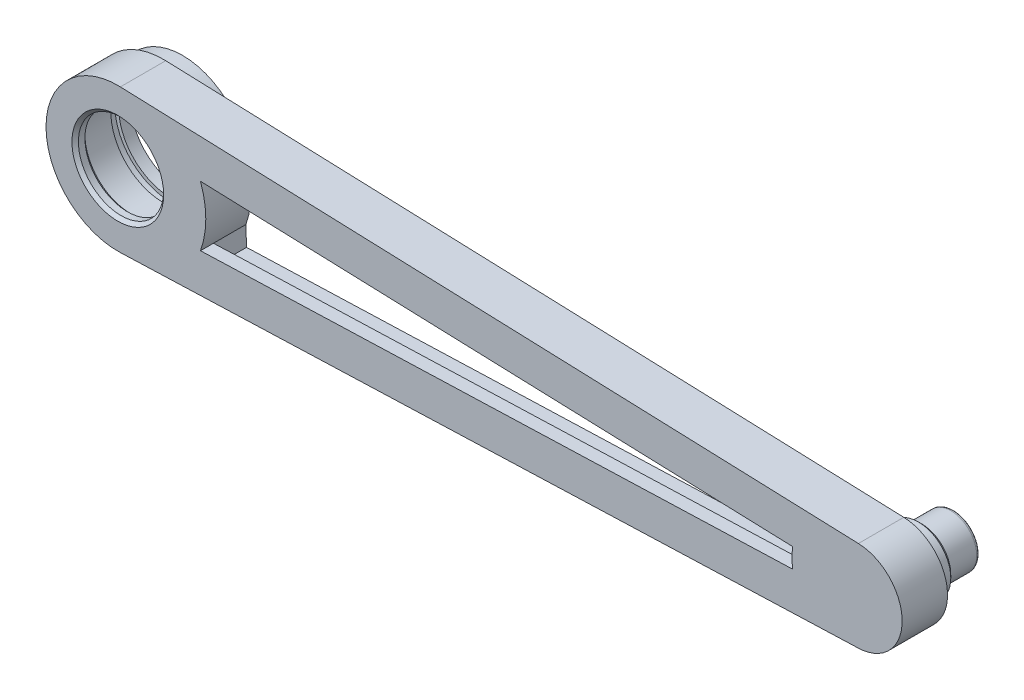
ISO-10303-21;
HEADER;
FILE_DESCRIPTION(('STEP AP214'),'2;1');
FILE_NAME('part.step','',(''),(''),'','','');
FILE_SCHEMA(('AUTOMOTIVE_DESIGN { 1 0 10303 214 1 1 1 1 }'));
ENDSEC;
DATA;
#1=APPLICATION_CONTEXT('core data for automotive mechanical design processes');
#2=APPLICATION_PROTOCOL_DEFINITION('international standard','automotive_design',2000,#1);
#3=PRODUCT_CONTEXT('',#1,'mechanical');
#4=PRODUCT('Part','Part','',(#3));
#5=PRODUCT_RELATED_PRODUCT_CATEGORY('part','',(#4));
#6=PRODUCT_DEFINITION_FORMATION('','',#4);
#7=PRODUCT_DEFINITION_CONTEXT('part definition',#1,'design');
#8=PRODUCT_DEFINITION('design','',#6,#7);
#9=PRODUCT_DEFINITION_SHAPE('','',#8);
#10=(LENGTH_UNIT() NAMED_UNIT(*) SI_UNIT(.MILLI.,.METRE.));
#11=(NAMED_UNIT(*) PLANE_ANGLE_UNIT() SI_UNIT($,.RADIAN.));
#12=(NAMED_UNIT(*) SI_UNIT($,.STERADIAN.) SOLID_ANGLE_UNIT());
#13=UNCERTAINTY_MEASURE_WITH_UNIT(LENGTH_MEASURE(1.E-05),#10,'distance_accuracy_value','');
#14=(GEOMETRIC_REPRESENTATION_CONTEXT(3) GLOBAL_UNCERTAINTY_ASSIGNED_CONTEXT((#13)) GLOBAL_UNIT_ASSIGNED_CONTEXT((#10,
#11,#12)) REPRESENTATION_CONTEXT('',''));
#15=CARTESIAN_POINT('',(0.,0.,0.));
#16=DIRECTION('',(0.,0.,1.));
#17=DIRECTION('',(1.,0.,0.));
#18=AXIS2_PLACEMENT_3D('',#15,#16,#17);
#19=CARTESIAN_POINT('',(0.,0.,7.));
#20=DIRECTION('',(0.,0.,-1.));
#21=DIRECTION('',(-1.,0.,0.));
#22=AXIS2_PLACEMENT_3D('',#19,#20,#21);
#23=CYLINDRICAL_SURFACE('',#22,8.075);
#24=CARTESIAN_POINT('',(0.,0.,-3.));
#25=DIRECTION('',(0.,0.,-1.));
#26=DIRECTION('',(-1.,0.,0.));
#27=AXIS2_PLACEMENT_3D('',#24,#25,#26);
#28=CIRCLE('',#27,8.075);
#29=CARTESIAN_POINT('',(-8.075,0.,-3.));
#30=VERTEX_POINT('',#29);
#31=EDGE_CURVE('E315',#30,#30,#28,.T.);
#32=ORIENTED_EDGE('',*,*,#31,.T.);
#33=EDGE_LOOP('',(#32));
#34=FACE_BOUND('',#33,.T.);
#35=CARTESIAN_POINT('',(0.,0.,-1.2));
#36=DIRECTION('',(0.,0.,1.));
#37=DIRECTION('',(1.,0.,0.));
#38=AXIS2_PLACEMENT_3D('',#35,#36,#37);
#39=CIRCLE('',#38,8.075);
#40=CARTESIAN_POINT('',(8.075,0.,-1.2));
#41=VERTEX_POINT('',#40);
#42=EDGE_CURVE('E51',#41,#41,#39,.T.);
#43=ORIENTED_EDGE('',*,*,#42,.T.);
#44=EDGE_LOOP('',(#43));
#45=FACE_BOUND('',#44,.T.);
#46=ADVANCED_FACE('F50',(#34,#45),#23,.F.);
#47=CARTESIAN_POINT('',(0.,0.,0.));
#48=DIRECTION('',(0.,0.,1.));
#49=DIRECTION('',(1.,0.,0.));
#50=AXIS2_PLACEMENT_3D('',#47,#48,#49);
#51=PLANE('',#50);
#52=DIRECTION('',(0.0342782664469188,-0.99941232754524,0.));
#53=VECTOR('',#52,1.);
#54=CARTESIAN_POINT('',(104.114209315076,-1.50703103281399,0.));
#55=LINE('',#54,#53);
#56=CARTESIAN_POINT('',(104.114209315076,-1.50703103281399,0.));
#57=VERTEX_POINT('',#56);
#58=CARTESIAN_POINT('',(104.217044114417,-4.50526801544971,0.));
#59=VERTEX_POINT('',#58);
#60=EDGE_CURVE('E61',#57,#59,#55,.T.);
#61=ORIENTED_EDGE('',*,*,#60,.F.);
#62=CARTESIAN_POINT('',(114.,0.,0.));
#63=DIRECTION('',(0.,0.,-1.));
#64=DIRECTION('',(-1.,0.,0.));
#65=AXIS2_PLACEMENT_3D('',#62,#63,#64);
#66=CIRCLE('',#65,9.99999999999997);
#67=CARTESIAN_POINT('',(104.114755838496,1.51061175271504,0.));
#68=VERTEX_POINT('',#67);
#69=EDGE_CURVE('E217',#57,#68,#66,.T.);
#70=ORIENTED_EDGE('',*,*,#69,.T.);
#71=DIRECTION('',(-0.0342436974789945,-0.999413512607753,0.));
#72=VECTOR('',#71,1.);
#73=CARTESIAN_POINT('',(104.217486930932,4.5088522905383,0.));
#74=LINE('',#73,#72);
#75=CARTESIAN_POINT('',(104.217486930932,4.5088522905383,0.));
#76=VERTEX_POINT('',#75);
#77=EDGE_CURVE('E200',#76,#68,#74,.T.);
#78=ORIENTED_EDGE('',*,*,#77,.F.);
#79=DIRECTION('',(0.999413512607753,-0.0342436974789916,0.));
#80=VECTOR('',#79,1.);
#81=CARTESIAN_POINT('',(12.8598047369581,7.63911298039967,0.));
#82=LINE('',#81,#80);
#83=CARTESIAN_POINT('',(12.8598047369581,7.63911298039967,0.));
#84=VERTEX_POINT('',#83);
#85=EDGE_CURVE('E202',#84,#76,#82,.T.);
#86=ORIENTED_EDGE('',*,*,#85,.F.);
#87=DIRECTION('',(0.0342436974789916,0.999413512607753,0.));
#88=VECTOR('',#87,1.);
#89=CARTESIAN_POINT('',(12.8598047369581,7.63911298039967,0.));
#90=LINE('',#89,#88);
#91=CARTESIAN_POINT('',(12.7570736445211,4.64087244257641,0.));
#92=VERTEX_POINT('',#91);
#93=EDGE_CURVE('E72',#92,#84,#90,.T.);
#94=ORIENTED_EDGE('',*,*,#93,.F.);
#95=CARTESIAN_POINT('',(0.,0.,0.));
#96=DIRECTION('',(0.,0.,-1.));
#97=DIRECTION('',(-1.,0.,0.));
#98=AXIS2_PLACEMENT_3D('',#95,#96,#97);
#99=CIRCLE('',#98,13.575);
#100=CARTESIAN_POINT('',(12.7572341613009,-4.64043118187699,0.));
#101=VERTEX_POINT('',#100);
#102=EDGE_CURVE('E222',#92,#101,#99,.T.);
#103=ORIENTED_EDGE('',*,*,#102,.T.);
#104=DIRECTION('',(-0.0342782664469217,0.99941232754524,0.));
#105=VECTOR('',#104,1.);
#106=CARTESIAN_POINT('',(12.7572341613009,-4.64043118187699,0.));
#107=LINE('',#106,#105);
#108=CARTESIAN_POINT('',(12.8600689606417,-7.63866816451271,0.));
#109=VERTEX_POINT('',#108);
#110=EDGE_CURVE('E167',#109,#101,#107,.T.);
#111=ORIENTED_EDGE('',*,*,#110,.F.);
#112=DIRECTION('',(-0.99941232754524,-0.034278266446919,0.));
#113=VECTOR('',#112,1.);
#114=CARTESIAN_POINT('',(104.217044114417,-4.50526801544971,0.));
#115=LINE('',#114,#113);
#116=EDGE_CURVE('E175',#59,#109,#115,.T.);
#117=ORIENTED_EDGE('',*,*,#116,.F.);
#118=EDGE_LOOP('',(#61,#70,#78,#86,#94,#103,#111,#117));
#119=FACE_BOUND('',#118,.T.);
#120=DIRECTION('',(0.999359513847041,0.0357849421321992,0.));
#121=VECTOR('',#120,1.);
#122=CARTESIAN_POINT('',(0.396318234114106,-11.067906615856,0.));
#123=LINE('',#122,#121);
#124=CARTESIAN_POINT('',(0.396318234114106,-11.067906615856,0.));
#125=VERTEX_POINT('',#124);
#126=CARTESIAN_POINT('',(114.,-7.00000000000001,0.));
#127=VERTEX_POINT('',#126);
#128=EDGE_CURVE('E249',#125,#127,#123,.T.);
#129=ORIENTED_EDGE('',*,*,#128,.F.);
#130=CARTESIAN_POINT('',(0.,0.,0.));
#131=DIRECTION('',(0.,0.,1.));
#132=DIRECTION('',(1.,0.,0.));
#133=AXIS2_PLACEMENT_3D('',#130,#131,#132);
#134=CIRCLE('',#133,11.075);
#135=CARTESIAN_POINT('',(0.395882675438596,11.067922203706,0.));
#136=VERTEX_POINT('',#135);
#137=EDGE_CURVE('E253',#136,#125,#134,.T.);
#138=ORIENTED_EDGE('',*,*,#137,.F.);
#139=DIRECTION('',(0.999360921327853,-0.0357456140350877,0.));
#140=VECTOR('',#139,1.);
#141=CARTESIAN_POINT('',(0.395882675438596,11.067922203706,0.));
#142=LINE('',#141,#140);
#143=CARTESIAN_POINT('',(114.250219298246,6.99552644929498,0.));
#144=VERTEX_POINT('',#143);
#145=EDGE_CURVE('E269',#136,#144,#142,.T.);
#146=ORIENTED_EDGE('',*,*,#145,.T.);
#147=CARTESIAN_POINT('',(114.,0.,0.));
#148=DIRECTION('',(0.,0.,1.));
#149=DIRECTION('',(1.,0.,0.));
#150=AXIS2_PLACEMENT_3D('',#147,#148,#149);
#151=CIRCLE('',#150,7.00000000000002);
#152=EDGE_CURVE('E265',#127,#144,#151,.T.);
#153=ORIENTED_EDGE('',*,*,#152,.F.);
#154=EDGE_LOOP('',(#129,#138,#146,#153));
#155=FACE_BOUND('',#154,.T.);
#156=CARTESIAN_POINT('',(114.,0.,0.));
#157=DIRECTION('',(0.,0.,1.));
#158=DIRECTION('',(1.,0.,0.));
#159=AXIS2_PLACEMENT_3D('',#156,#157,#158);
#160=CIRCLE('',#159,5.);
#161=CARTESIAN_POINT('',(119.,0.,0.));
#162=VERTEX_POINT('',#161);
#163=EDGE_CURVE('E281',#162,#162,#160,.F.);
#164=ORIENTED_EDGE('',*,*,#163,.F.);
#165=EDGE_LOOP('',(#164));
#166=FACE_BOUND('',#165,.T.);
#167=CARTESIAN_POINT('',(0.,0.,0.));
#168=DIRECTION('',(0.,0.,1.));
#169=DIRECTION('',(1.,0.,0.));
#170=AXIS2_PLACEMENT_3D('',#167,#168,#169);
#171=CIRCLE('',#170,10.075);
#172=CARTESIAN_POINT('',(10.075,0.,0.));
#173=VERTEX_POINT('',#172);
#174=EDGE_CURVE('E11',#173,#173,#171,.F.);
#175=ORIENTED_EDGE('',*,*,#174,.F.);
#176=EDGE_LOOP('',(#175));
#177=FACE_BOUND('',#176,.T.);
#178=ADVANCED_FACE('F350',(#119,#155,#166,#177),#51,.F.);
#179=CARTESIAN_POINT('',(114.,0.,-10.));
#180=DIRECTION('',(0.,0.,1.));
#181=DIRECTION('',(1.,0.,0.));
#182=AXIS2_PLACEMENT_3D('',#179,#180,#181);
#183=CYLINDRICAL_SURFACE('',#182,4.00000000000001);
#184=CARTESIAN_POINT('',(114.,0.,-7.5));
#185=DIRECTION('',(0.,0.,-1.));
#186=DIRECTION('',(-1.,0.,0.));
#187=AXIS2_PLACEMENT_3D('',#184,#185,#186);
#188=CIRCLE('',#187,4.00000000000001);
#189=CARTESIAN_POINT('',(110.,0.,-7.5));
#190=VERTEX_POINT('',#189);
#191=EDGE_CURVE('E57',#190,#190,#188,.F.);
#192=ORIENTED_EDGE('',*,*,#191,.T.);
#193=EDGE_LOOP('',(#192));
#194=FACE_BOUND('',#193,.T.);
#195=CARTESIAN_POINT('',(114.,0.,-3.));
#196=DIRECTION('',(0.,0.,-1.));
#197=DIRECTION('',(-1.,0.,0.));
#198=AXIS2_PLACEMENT_3D('',#195,#196,#197);
#199=CIRCLE('',#198,4.00000000000001);
#200=CARTESIAN_POINT('',(110.,0.,-3.));
#201=VERTEX_POINT('',#200);
#202=EDGE_CURVE('E225',#201,#201,#199,.T.);
#203=ORIENTED_EDGE('',*,*,#202,.T.);
#204=EDGE_LOOP('',(#203));
#205=FACE_BOUND('',#204,.T.);
#206=ADVANCED_FACE('F360',(#194,#205),#183,.T.);
#207=CARTESIAN_POINT('',(0.173786764705882,5.07202357648435,98.8279298080084));
#208=DIRECTION('',(0.0342436974789916,0.999413512607753,0.));
#209=DIRECTION('',(-0.999413512607753,0.0342436974789916,0.));
#210=AXIS2_PLACEMENT_3D('',#207,#208,#209);
#211=PLANE('',#210);
#212=DIRECTION('',(-0.999413512607753,0.0342436974789916,0.));
#213=VECTOR('',#212,1.);
#214=CARTESIAN_POINT('',(12.7570736445211,4.64087244257641,5.));
#215=LINE('',#214,#213);
#216=CARTESIAN_POINT('',(104.114755838496,1.51061175271504,5.));
#217=VERTEX_POINT('',#216);
#218=CARTESIAN_POINT('',(12.7570736445211,4.64087244257641,5.));
#219=VERTEX_POINT('',#218);
#220=EDGE_CURVE('E192',#217,#219,#215,.T.);
#221=ORIENTED_EDGE('',*,*,#220,.F.);
#222=DIRECTION('',(0.,0.,-1.));
#223=VECTOR('',#222,1.);
#224=CARTESIAN_POINT('',(104.114755838496,1.51061175271504,98.8279298080084));
#225=LINE('',#224,#223);
#226=CARTESIAN_POINT('',(104.114755838496,1.51061175271504,7.00000000000001));
#227=VERTEX_POINT('',#226);
#228=EDGE_CURVE('E229',#227,#217,#225,.T.);
#229=ORIENTED_EDGE('',*,*,#228,.F.);
#230=DIRECTION('',(0.999413512607753,-0.0342436974789916,0.));
#231=VECTOR('',#230,1.);
#232=CARTESIAN_POINT('',(0.173786764705882,5.07202357648435,7.00000000000001));
#233=LINE('',#232,#231);
#234=CARTESIAN_POINT('',(12.7570736445211,4.64087244257641,7.00000000000001));
#235=VERTEX_POINT('',#234);
#236=EDGE_CURVE('E227',#235,#227,#233,.T.);
#237=ORIENTED_EDGE('',*,*,#236,.F.);
#238=DIRECTION('',(0.,0.,-1.));
#239=VECTOR('',#238,1.);
#240=CARTESIAN_POINT('',(12.7570736445211,4.64087244257641,98.8279298080084));
#241=LINE('',#240,#239);
#242=EDGE_CURVE('E228',#235,#219,#241,.T.);
#243=ORIENTED_EDGE('',*,*,#242,.T.);
#244=EDGE_LOOP('',(#221,#229,#237,#243));
#245=FACE_BOUND('',#244,.T.);
#246=ADVANCED_FACE('F374',(#245),#211,.F.);
#247=CARTESIAN_POINT('',(0.173962202218114,-5.07201756229209,98.8279298080084));
#248=DIRECTION('',(0.034278266446919,-0.99941232754524,0.));
#249=DIRECTION('',(0.99941232754524,0.034278266446919,0.));
#250=AXIS2_PLACEMENT_3D('',#247,#248,#249);
#251=PLANE('',#250);
#252=DIRECTION('',(0.99941232754524,0.034278266446919,0.));
#253=VECTOR('',#252,1.);
#254=CARTESIAN_POINT('',(104.114209315076,-1.50703103281399,5.));
#255=LINE('',#254,#253);
#256=CARTESIAN_POINT('',(12.7572341613009,-4.64043118187699,5.));
#257=VERTEX_POINT('',#256);
#258=CARTESIAN_POINT('',(104.114209315076,-1.50703103281399,5.));
#259=VERTEX_POINT('',#258);
#260=EDGE_CURVE('E157',#257,#259,#255,.T.);
#261=ORIENTED_EDGE('',*,*,#260,.F.);
#262=DIRECTION('',(0.,0.,-1.));
#263=VECTOR('',#262,1.);
#264=CARTESIAN_POINT('',(12.7572341613009,-4.64043118187699,98.8279298080084));
#265=LINE('',#264,#263);
#266=CARTESIAN_POINT('',(12.7572341613009,-4.64043118187699,7.00000000000001));
#267=VERTEX_POINT('',#266);
#268=EDGE_CURVE('E232',#267,#257,#265,.T.);
#269=ORIENTED_EDGE('',*,*,#268,.F.);
#270=DIRECTION('',(-0.99941232754524,-0.034278266446919,0.));
#271=VECTOR('',#270,1.);
#272=CARTESIAN_POINT('',(0.173962202218114,-5.07201756229209,7.00000000000001));
#273=LINE('',#272,#271);
#274=CARTESIAN_POINT('',(104.114209315076,-1.50703103281399,7.00000000000001));
#275=VERTEX_POINT('',#274);
#276=EDGE_CURVE('E220',#275,#267,#273,.T.);
#277=ORIENTED_EDGE('',*,*,#276,.F.);
#278=DIRECTION('',(0.,0.,-1.));
#279=VECTOR('',#278,1.);
#280=CARTESIAN_POINT('',(104.114209315076,-1.50703103281399,98.8279298080084));
#281=LINE('',#280,#279);
#282=EDGE_CURVE('E221',#275,#259,#281,.T.);
#283=ORIENTED_EDGE('',*,*,#282,.T.);
#284=EDGE_LOOP('',(#261,#269,#277,#283));
#285=FACE_BOUND('',#284,.T.);
#286=ADVANCED_FACE('F362',(#285),#251,.F.);
#287=CARTESIAN_POINT('',(0.,0.,0.));
#288=DIRECTION('',(0.,0.,1.));
#289=DIRECTION('',(1.,0.,0.));
#290=AXIS2_PLACEMENT_3D('',#287,#288,#289);
#291=CIRCLE('',#290,8.075);
#292=CARTESIAN_POINT('',(8.075,0.,0.));
#293=VERTEX_POINT('',#292);
#294=EDGE_CURVE('E306',#293,#293,#291,.T.);
#295=ORIENTED_EDGE('',*,*,#294,.F.);
#296=EDGE_LOOP('',(#295));
#297=FACE_BOUND('',#296,.T.);
#298=CARTESIAN_POINT('',(0.,0.,5.));
#299=DIRECTION('',(0.,0.,1.));
#300=DIRECTION('',(1.,0.,0.));
#301=AXIS2_PLACEMENT_3D('',#298,#299,#300);
#302=CIRCLE('',#301,8.075);
#303=CARTESIAN_POINT('',(8.075,0.,5.));
#304=VERTEX_POINT('',#303);
#305=EDGE_CURVE('E250',#304,#304,#302,.T.);
#306=ORIENTED_EDGE('',*,*,#305,.T.);
#307=EDGE_LOOP('',(#306));
#308=FACE_BOUND('',#307,.T.);
#309=ADVANCED_FACE('F354',(#297,#308),#23,.F.);
#310=CARTESIAN_POINT('',(0.396318234114106,-11.067906615856,7.));
#311=DIRECTION('',(-0.0357849421321992,0.999359513847041,0.));
#312=DIRECTION('',(-0.999359513847041,-0.0357849421321992,0.));
#313=AXIS2_PLACEMENT_3D('',#310,#311,#312);
#314=PLANE('',#313);
#315=ORIENTED_EDGE('',*,*,#128,.T.);
#316=DIRECTION('',(0.,0.,-1.));
#317=VECTOR('',#316,1.);
#318=CARTESIAN_POINT('',(114.,-7.00000000000001,7.));
#319=LINE('',#318,#317);
#320=CARTESIAN_POINT('',(114.,-7.00000000000001,7.));
#321=VERTEX_POINT('',#320);
#322=EDGE_CURVE('E280',#321,#127,#319,.T.);
#323=ORIENTED_EDGE('',*,*,#322,.F.);
#324=DIRECTION('',(0.999359513847041,0.0357849421321992,0.));
#325=VECTOR('',#324,1.);
#326=CARTESIAN_POINT('',(0.396318234114106,-11.067906615856,7.));
#327=LINE('',#326,#325);
#328=CARTESIAN_POINT('',(0.396318234114106,-11.067906615856,7.));
#329=VERTEX_POINT('',#328);
#330=EDGE_CURVE('E252',#329,#321,#327,.T.);
#331=ORIENTED_EDGE('',*,*,#330,.F.);
#332=DIRECTION('',(0.,0.,-1.));
#333=VECTOR('',#332,1.);
#334=CARTESIAN_POINT('',(0.396318234114106,-11.067906615856,7.));
#335=LINE('',#334,#333);
#336=EDGE_CURVE('E262',#329,#125,#335,.T.);
#337=ORIENTED_EDGE('',*,*,#336,.T.);
#338=EDGE_LOOP('',(#315,#323,#331,#337));
#339=FACE_BOUND('',#338,.T.);
#340=ADVANCED_FACE('F364',(#339),#314,.F.);
#341=CARTESIAN_POINT('',(114.,0.,7.));
#342=DIRECTION('',(0.,0.,-1.));
#343=DIRECTION('',(-1.,0.,0.));
#344=AXIS2_PLACEMENT_3D('',#341,#342,#343);
#345=CYLINDRICAL_SURFACE('',#344,7.00000000000002);
#346=ORIENTED_EDGE('',*,*,#152,.T.);
#347=DIRECTION('',(0.,0.,-1.));
#348=VECTOR('',#347,1.);
#349=CARTESIAN_POINT('',(114.250219298246,6.99552644929498,7.));
#350=LINE('',#349,#348);
#351=CARTESIAN_POINT('',(114.250219298246,6.99552644929498,7.));
#352=VERTEX_POINT('',#351);
#353=EDGE_CURVE('E277',#352,#144,#350,.T.);
#354=ORIENTED_EDGE('',*,*,#353,.F.);
#355=CARTESIAN_POINT('',(114.,0.,7.));
#356=DIRECTION('',(0.,0.,1.));
#357=DIRECTION('',(1.,0.,0.));
#358=AXIS2_PLACEMENT_3D('',#355,#356,#357);
#359=CIRCLE('',#358,7.00000000000002);
#360=EDGE_CURVE('E251',#321,#352,#359,.T.);
#361=ORIENTED_EDGE('',*,*,#360,.F.);
#362=ORIENTED_EDGE('',*,*,#322,.T.);
#363=EDGE_LOOP('',(#346,#354,#361,#362));
#364=FACE_BOUND('',#363,.T.);
#365=ADVANCED_FACE('F371',(#364),#345,.T.);
#366=CARTESIAN_POINT('',(0.395882675438596,11.067922203706,7.));
#367=DIRECTION('',(0.0357456140350877,0.999360921327853,0.));
#368=DIRECTION('',(-0.999360921327853,0.0357456140350877,0.));
#369=AXIS2_PLACEMENT_3D('',#366,#367,#368);
#370=PLANE('',#369);
#371=ORIENTED_EDGE('',*,*,#145,.F.);
#372=DIRECTION('',(0.,0.,-1.));
#373=VECTOR('',#372,1.);
#374=CARTESIAN_POINT('',(0.395882675438596,11.067922203706,7.));
#375=LINE('',#374,#373);
#376=CARTESIAN_POINT('',(0.395882675438596,11.067922203706,7.));
#377=VERTEX_POINT('',#376);
#378=EDGE_CURVE('E274',#377,#136,#375,.T.);
#379=ORIENTED_EDGE('',*,*,#378,.F.);
#380=DIRECTION('',(0.999360921327853,-0.0357456140350877,0.));
#381=VECTOR('',#380,1.);
#382=CARTESIAN_POINT('',(0.395882675438596,11.067922203706,7.));
#383=LINE('',#382,#381);
#384=EDGE_CURVE('E259',#377,#352,#383,.T.);
#385=ORIENTED_EDGE('',*,*,#384,.T.);
#386=ORIENTED_EDGE('',*,*,#353,.T.);
#387=EDGE_LOOP('',(#371,#379,#385,#386));
#388=FACE_BOUND('',#387,.T.);
#389=ADVANCED_FACE('F678',(#388),#370,.T.);
#390=CARTESIAN_POINT('',(0.,0.,7.));
#391=DIRECTION('',(0.,0.,-1.));
#392=DIRECTION('',(-1.,0.,0.));
#393=AXIS2_PLACEMENT_3D('',#390,#391,#392);
#394=CYLINDRICAL_SURFACE('',#393,11.075);
#395=ORIENTED_EDGE('',*,*,#137,.T.);
#396=ORIENTED_EDGE('',*,*,#336,.F.);
#397=CARTESIAN_POINT('',(0.,0.,7.));
#398=DIRECTION('',(0.,0.,1.));
#399=DIRECTION('',(1.,0.,0.));
#400=AXIS2_PLACEMENT_3D('',#397,#398,#399);
#401=CIRCLE('',#400,11.075);
#402=EDGE_CURVE('E258',#377,#329,#401,.T.);
#403=ORIENTED_EDGE('',*,*,#402,.F.);
#404=ORIENTED_EDGE('',*,*,#378,.T.);
#405=EDGE_LOOP('',(#395,#396,#403,#404));
#406=FACE_BOUND('',#405,.T.);
#407=ADVANCED_FACE('F395',(#406),#394,.T.);
#408=CARTESIAN_POINT('',(0.,0.,7.));
#409=DIRECTION('',(0.,0.,1.));
#410=DIRECTION('',(1.,0.,0.));
#411=AXIS2_PLACEMENT_3D('',#408,#409,#410);
#412=PLANE('',#411);
#413=ORIENTED_EDGE('',*,*,#236,.T.);
#414=CARTESIAN_POINT('',(114.,0.,7.00000000000001));
#415=DIRECTION('',(0.,0.,1.));
#416=DIRECTION('',(1.,0.,0.));
#417=AXIS2_PLACEMENT_3D('',#414,#415,#416);
#418=CIRCLE('',#417,9.99999999999997);
#419=EDGE_CURVE('E233',#275,#227,#418,.F.);
#420=ORIENTED_EDGE('',*,*,#419,.F.);
#421=ORIENTED_EDGE('',*,*,#276,.T.);
#422=CARTESIAN_POINT('',(0.,0.,7.00000000000001));
#423=DIRECTION('',(0.,0.,1.));
#424=DIRECTION('',(1.,0.,0.));
#425=AXIS2_PLACEMENT_3D('',#422,#423,#424);
#426=CIRCLE('',#425,13.575);
#427=EDGE_CURVE('E183',#235,#267,#426,.F.);
#428=ORIENTED_EDGE('',*,*,#427,.F.);
#429=EDGE_LOOP('',(#413,#420,#421,#428));
#430=FACE_BOUND('',#429,.T.);
#431=CARTESIAN_POINT('',(0.,0.,7.));
#432=DIRECTION('',(0.,0.,1.));
#433=DIRECTION('',(1.,0.,0.));
#434=AXIS2_PLACEMENT_3D('',#431,#432,#433);
#435=CIRCLE('',#434,7.07500000000004);
#436=CARTESIAN_POINT('',(7.07500000000004,0.,7.));
#437=VERTEX_POINT('',#436);
#438=EDGE_CURVE('E290',#437,#437,#435,.F.);
#439=ORIENTED_EDGE('',*,*,#438,.T.);
#440=EDGE_LOOP('',(#439));
#441=FACE_BOUND('',#440,.T.);
#442=ORIENTED_EDGE('',*,*,#330,.T.);
#443=ORIENTED_EDGE('',*,*,#360,.T.);
#444=ORIENTED_EDGE('',*,*,#384,.F.);
#445=ORIENTED_EDGE('',*,*,#402,.T.);
#446=EDGE_LOOP('',(#442,#443,#444,#445));
#447=FACE_BOUND('',#446,.T.);
#448=ADVANCED_FACE('F381',(#430,#441,#447),#412,.T.);
#449=CARTESIAN_POINT('',(0.,0.,5.));
#450=DIRECTION('',(0.,0.,1.));
#451=DIRECTION('',(1.,0.,0.));
#452=AXIS2_PLACEMENT_3D('',#449,#450,#451);
#453=PLANE('',#452);
#454=CARTESIAN_POINT('',(0.,0.,5.));
#455=DIRECTION('',(0.,0.,1.));
#456=DIRECTION('',(1.,0.,0.));
#457=AXIS2_PLACEMENT_3D('',#454,#455,#456);
#458=CIRCLE('',#457,7.075);
#459=CARTESIAN_POINT('',(7.075,0.,5.));
#460=VERTEX_POINT('',#459);
#461=EDGE_CURVE('E291',#460,#460,#458,.T.);
#462=ORIENTED_EDGE('',*,*,#461,.T.);
#463=EDGE_LOOP('',(#462));
#464=FACE_BOUND('',#463,.T.);
#465=ORIENTED_EDGE('',*,*,#305,.F.);
#466=EDGE_LOOP('',(#465));
#467=FACE_BOUND('',#466,.T.);
#468=ADVANCED_FACE('F382',(#464,#467),#453,.F.);
#469=CARTESIAN_POINT('',(0.,0.,5.));
#470=DIRECTION('',(0.,0.,1.));
#471=DIRECTION('',(1.,0.,0.));
#472=AXIS2_PLACEMENT_3D('',#469,#470,#471);
#473=CYLINDRICAL_SURFACE('',#472,6.575);
#474=CARTESIAN_POINT('',(0.,0.,6.49999999999995));
#475=DIRECTION('',(0.,0.,1.));
#476=DIRECTION('',(1.,0.,0.));
#477=AXIS2_PLACEMENT_3D('',#474,#475,#476);
#478=CIRCLE('',#477,6.575);
#479=CARTESIAN_POINT('',(6.575,0.,6.49999999999995));
#480=VERTEX_POINT('',#479);
#481=EDGE_CURVE('E287',#480,#480,#478,.T.);
#482=ORIENTED_EDGE('',*,*,#481,.T.);
#483=EDGE_LOOP('',(#482));
#484=FACE_BOUND('',#483,.T.);
#485=CARTESIAN_POINT('',(0.,0.,5.49999999999999));
#486=DIRECTION('',(0.,0.,1.));
#487=DIRECTION('',(1.,0.,0.));
#488=AXIS2_PLACEMENT_3D('',#485,#486,#487);
#489=CIRCLE('',#488,6.575);
#490=CARTESIAN_POINT('',(6.575,0.,5.49999999999999));
#491=VERTEX_POINT('',#490);
#492=EDGE_CURVE('E283',#491,#491,#489,.F.);
#493=ORIENTED_EDGE('',*,*,#492,.T.);
#494=EDGE_LOOP('',(#493));
#495=FACE_BOUND('',#494,.T.);
#496=ADVANCED_FACE('F384',(#484,#495),#473,.F.);
#497=CARTESIAN_POINT('',(114.,0.,-3.));
#498=DIRECTION('',(0.,0.,-1.));
#499=DIRECTION('',(-1.,0.,0.));
#500=AXIS2_PLACEMENT_3D('',#497,#498,#499);
#501=PLANE('',#500);
#502=CARTESIAN_POINT('',(114.,0.,-3.));
#503=DIRECTION('',(0.,0.,-1.));
#504=DIRECTION('',(-1.,0.,0.));
#505=AXIS2_PLACEMENT_3D('',#502,#503,#504);
#506=CIRCLE('',#505,4.50000000000002);
#507=CARTESIAN_POINT('',(109.5,0.,-3.));
#508=VERTEX_POINT('',#507);
#509=EDGE_CURVE('E298',#508,#508,#506,.T.);
#510=ORIENTED_EDGE('',*,*,#509,.T.);
#511=EDGE_LOOP('',(#510));
#512=FACE_BOUND('',#511,.T.);
#513=ORIENTED_EDGE('',*,*,#202,.F.);
#514=EDGE_LOOP('',(#513));
#515=FACE_BOUND('',#514,.T.);
#516=ADVANCED_FACE('F391',(#512,#515),#501,.T.);
#517=CARTESIAN_POINT('',(114.,0.,-3.));
#518=DIRECTION('',(0.,0.,1.));
#519=DIRECTION('',(1.,0.,0.));
#520=AXIS2_PLACEMENT_3D('',#517,#518,#519);
#521=CYLINDRICAL_SURFACE('',#520,5.);
#522=CARTESIAN_POINT('',(114.,0.,-2.5));
#523=DIRECTION('',(0.,0.,-1.));
#524=DIRECTION('',(-1.,0.,0.));
#525=AXIS2_PLACEMENT_3D('',#522,#523,#524);
#526=CIRCLE('',#525,5.);
#527=CARTESIAN_POINT('',(109.,0.,-2.5));
#528=VERTEX_POINT('',#527);
#529=EDGE_CURVE('E299',#528,#528,#526,.F.);
#530=ORIENTED_EDGE('',*,*,#529,.T.);
#531=EDGE_LOOP('',(#530));
#532=FACE_BOUND('',#531,.T.);
#533=ORIENTED_EDGE('',*,*,#163,.T.);
#534=EDGE_LOOP('',(#533));
#535=FACE_BOUND('',#534,.T.);
#536=ADVANCED_FACE('F402',(#532,#535),#521,.T.);
#537=CARTESIAN_POINT('',(0.,0.,6.49999999999995));
#538=DIRECTION('',(0.,0.,1.));
#539=DIRECTION('',(1.,0.,0.));
#540=AXIS2_PLACEMENT_3D('',#537,#538,#539);
#541=CONICAL_SURFACE('',#540,6.575,0.78539816339744);
#542=ORIENTED_EDGE('',*,*,#438,.F.);
#543=EDGE_LOOP('',(#542));
#544=FACE_BOUND('',#543,.T.);
#545=ORIENTED_EDGE('',*,*,#481,.F.);
#546=EDGE_LOOP('',(#545));
#547=FACE_BOUND('',#546,.T.);
#548=ADVANCED_FACE('F404',(#544,#547),#541,.F.);
#549=CARTESIAN_POINT('',(0.,0.,5.));
#550=DIRECTION('',(0.,0.,-1.));
#551=DIRECTION('',(-1.,0.,0.));
#552=AXIS2_PLACEMENT_3D('',#549,#550,#551);
#553=CONICAL_SURFACE('',#552,7.075,0.785398163397458);
#554=ORIENTED_EDGE('',*,*,#492,.F.);
#555=EDGE_LOOP('',(#554));
#556=FACE_BOUND('',#555,.T.);
#557=ORIENTED_EDGE('',*,*,#461,.F.);
#558=EDGE_LOOP('',(#557));
#559=FACE_BOUND('',#558,.T.);
#560=ADVANCED_FACE('F612',(#556,#559),#553,.F.);
#561=CARTESIAN_POINT('',(114.,0.,-3.));
#562=DIRECTION('',(0.,0.,1.));
#563=DIRECTION('',(1.,0.,0.));
#564=AXIS2_PLACEMENT_3D('',#561,#562,#563);
#565=CONICAL_SURFACE('',#564,4.50000000000002,0.785398163397438);
#566=ORIENTED_EDGE('',*,*,#529,.F.);
#567=EDGE_LOOP('',(#566));
#568=FACE_BOUND('',#567,.T.);
#569=ORIENTED_EDGE('',*,*,#509,.F.);
#570=EDGE_LOOP('',(#569));
#571=FACE_BOUND('',#570,.T.);
#572=ADVANCED_FACE('F415',(#568,#571),#565,.T.);
#573=CARTESIAN_POINT('',(114.,0.,98.8279298080084));
#574=DIRECTION('',(0.,0.,-1.));
#575=DIRECTION('',(-1.,0.,0.));
#576=AXIS2_PLACEMENT_3D('',#573,#574,#575);
#577=CYLINDRICAL_SURFACE('',#576,9.99999999999997);
#578=ORIENTED_EDGE('',*,*,#419,.T.);
#579=ORIENTED_EDGE('',*,*,#228,.T.);
#580=DIRECTION('',(0.,0.,-1.));
#581=VECTOR('',#580,1.);
#582=CARTESIAN_POINT('',(104.114755838496,1.51061175271504,5.));
#583=LINE('',#582,#581);
#584=EDGE_CURVE('E191',#217,#68,#583,.T.);
#585=ORIENTED_EDGE('',*,*,#584,.T.);
#586=ORIENTED_EDGE('',*,*,#69,.F.);
#587=DIRECTION('',(0.,0.,-1.));
#588=VECTOR('',#587,1.);
#589=CARTESIAN_POINT('',(104.114209315076,-1.50703103281399,5.));
#590=LINE('',#589,#588);
#591=EDGE_CURVE('E185',#259,#57,#590,.T.);
#592=ORIENTED_EDGE('',*,*,#591,.F.);
#593=ORIENTED_EDGE('',*,*,#282,.F.);
#594=EDGE_LOOP('',(#578,#579,#585,#586,#592,#593));
#595=FACE_BOUND('',#594,.T.);
#596=ADVANCED_FACE('F412',(#595),#577,.T.);
#597=CARTESIAN_POINT('',(0.,0.,98.8279298080084));
#598=DIRECTION('',(0.,0.,-1.));
#599=DIRECTION('',(-1.,0.,0.));
#600=AXIS2_PLACEMENT_3D('',#597,#598,#599);
#601=CYLINDRICAL_SURFACE('',#600,13.575);
#602=ORIENTED_EDGE('',*,*,#427,.T.);
#603=ORIENTED_EDGE('',*,*,#268,.T.);
#604=DIRECTION('',(0.,0.,-1.));
#605=VECTOR('',#604,1.);
#606=CARTESIAN_POINT('',(12.7572341613009,-4.64043118187699,5.));
#607=LINE('',#606,#605);
#608=EDGE_CURVE('E184',#257,#101,#607,.T.);
#609=ORIENTED_EDGE('',*,*,#608,.T.);
#610=ORIENTED_EDGE('',*,*,#102,.F.);
#611=DIRECTION('',(0.,0.,-1.));
#612=VECTOR('',#611,1.);
#613=CARTESIAN_POINT('',(12.7570736445211,4.64087244257641,5.));
#614=LINE('',#613,#612);
#615=EDGE_CURVE('E197',#219,#92,#614,.T.);
#616=ORIENTED_EDGE('',*,*,#615,.F.);
#617=ORIENTED_EDGE('',*,*,#242,.F.);
#618=EDGE_LOOP('',(#602,#603,#609,#610,#616,#617));
#619=FACE_BOUND('',#618,.T.);
#620=ADVANCED_FACE('F413',(#619),#601,.T.);
#621=CARTESIAN_POINT('',(12.8598047369581,7.63911298039967,5.));
#622=DIRECTION('',(-0.999413512607753,0.0342436974789916,0.));
#623=DIRECTION('',(-0.0342436974789916,-0.999413512607753,0.));
#624=AXIS2_PLACEMENT_3D('',#621,#622,#623);
#625=PLANE('',#624);
#626=ORIENTED_EDGE('',*,*,#93,.T.);
#627=DIRECTION('',(0.,0.,-1.));
#628=VECTOR('',#627,1.);
#629=CARTESIAN_POINT('',(12.8598047369581,7.63911298039967,5.));
#630=LINE('',#629,#628);
#631=CARTESIAN_POINT('',(12.8598047369581,7.63911298039967,5.));
#632=VERTEX_POINT('',#631);
#633=EDGE_CURVE('E186',#632,#84,#630,.T.);
#634=ORIENTED_EDGE('',*,*,#633,.F.);
#635=DIRECTION('',(0.0342436974789916,0.999413512607753,0.));
#636=VECTOR('',#635,1.);
#637=CARTESIAN_POINT('',(12.8598047369581,7.63911298039967,5.));
#638=LINE('',#637,#636);
#639=EDGE_CURVE('E204',#219,#632,#638,.T.);
#640=ORIENTED_EDGE('',*,*,#639,.F.);
#641=ORIENTED_EDGE('',*,*,#615,.T.);
#642=EDGE_LOOP('',(#626,#634,#640,#641));
#643=FACE_BOUND('',#642,.T.);
#644=ADVANCED_FACE('F420',(#643),#625,.F.);
#645=CARTESIAN_POINT('',(104.217486930932,4.5088522905383,5.));
#646=DIRECTION('',(0.999413512607753,-0.0342436974789945,0.));
#647=DIRECTION('',(0.0342436974789945,0.999413512607753,0.));
#648=AXIS2_PLACEMENT_3D('',#645,#646,#647);
#649=PLANE('',#648);
#650=ORIENTED_EDGE('',*,*,#77,.T.);
#651=ORIENTED_EDGE('',*,*,#584,.F.);
#652=DIRECTION('',(-0.0342436974789945,-0.999413512607753,0.));
#653=VECTOR('',#652,1.);
#654=CARTESIAN_POINT('',(104.217486930932,4.5088522905383,5.));
#655=LINE('',#654,#653);
#656=CARTESIAN_POINT('',(104.217486930932,4.5088522905383,5.));
#657=VERTEX_POINT('',#656);
#658=EDGE_CURVE('E209',#657,#217,#655,.T.);
#659=ORIENTED_EDGE('',*,*,#658,.F.);
#660=DIRECTION('',(0.,0.,-1.));
#661=VECTOR('',#660,1.);
#662=CARTESIAN_POINT('',(104.217486930932,4.5088522905383,5.));
#663=LINE('',#662,#661);
#664=EDGE_CURVE('E194',#657,#76,#663,.T.);
#665=ORIENTED_EDGE('',*,*,#664,.T.);
#666=EDGE_LOOP('',(#650,#651,#659,#665));
#667=FACE_BOUND('',#666,.T.);
#668=ADVANCED_FACE('F430',(#667),#649,.F.);
#669=CARTESIAN_POINT('',(12.8598047369581,7.63911298039967,5.));
#670=DIRECTION('',(0.0342436974789916,0.999413512607753,0.));
#671=DIRECTION('',(-0.999413512607753,0.0342436974789916,0.));
#672=AXIS2_PLACEMENT_3D('',#669,#670,#671);
#673=PLANE('',#672);
#674=ORIENTED_EDGE('',*,*,#85,.T.);
#675=ORIENTED_EDGE('',*,*,#664,.F.);
#676=DIRECTION('',(0.999413512607753,-0.0342436974789916,0.));
#677=VECTOR('',#676,1.);
#678=CARTESIAN_POINT('',(12.8598047369581,7.63911298039967,5.));
#679=LINE('',#678,#677);
#680=EDGE_CURVE('E214',#632,#657,#679,.T.);
#681=ORIENTED_EDGE('',*,*,#680,.F.);
#682=ORIENTED_EDGE('',*,*,#633,.T.);
#683=EDGE_LOOP('',(#674,#675,#681,#682));
#684=FACE_BOUND('',#683,.T.);
#685=ADVANCED_FACE('F424',(#684),#673,.F.);
#686=CARTESIAN_POINT('',(0.,0.,5.));
#687=DIRECTION('',(0.,0.,1.));
#688=DIRECTION('',(1.,0.,0.));
#689=AXIS2_PLACEMENT_3D('',#686,#687,#688);
#690=PLANE('',#689);
#691=ORIENTED_EDGE('',*,*,#639,.T.);
#692=ORIENTED_EDGE('',*,*,#680,.T.);
#693=ORIENTED_EDGE('',*,*,#658,.T.);
#694=ORIENTED_EDGE('',*,*,#220,.T.);
#695=EDGE_LOOP('',(#691,#692,#693,#694));
#696=FACE_BOUND('',#695,.T.);
#697=ADVANCED_FACE('F422',(#696),#690,.F.);
#698=CARTESIAN_POINT('',(104.114209315076,-1.50703103281399,5.));
#699=DIRECTION('',(0.99941232754524,0.0342782664469188,0.));
#700=DIRECTION('',(-0.0342782664469188,0.99941232754524,0.));
#701=AXIS2_PLACEMENT_3D('',#698,#699,#700);
#702=PLANE('',#701);
#703=ORIENTED_EDGE('',*,*,#60,.T.);
#704=DIRECTION('',(0.,0.,-1.));
#705=VECTOR('',#704,1.);
#706=CARTESIAN_POINT('',(104.217044114417,-4.50526801544971,5.));
#707=LINE('',#706,#705);
#708=CARTESIAN_POINT('',(104.217044114417,-4.50526801544971,5.));
#709=VERTEX_POINT('',#708);
#710=EDGE_CURVE('E149',#709,#59,#707,.T.);
#711=ORIENTED_EDGE('',*,*,#710,.F.);
#712=DIRECTION('',(0.0342782664469188,-0.99941232754524,0.));
#713=VECTOR('',#712,1.);
#714=CARTESIAN_POINT('',(104.114209315076,-1.50703103281399,5.));
#715=LINE('',#714,#713);
#716=EDGE_CURVE('E151',#259,#709,#715,.T.);
#717=ORIENTED_EDGE('',*,*,#716,.F.);
#718=ORIENTED_EDGE('',*,*,#591,.T.);
#719=EDGE_LOOP('',(#703,#711,#717,#718));
#720=FACE_BOUND('',#719,.T.);
#721=ADVANCED_FACE('F146',(#720),#702,.F.);
#722=CARTESIAN_POINT('',(12.7572341613009,-4.64043118187699,5.));
#723=DIRECTION('',(-0.99941232754524,-0.0342782664469217,0.));
#724=DIRECTION('',(0.0342782664469217,-0.99941232754524,0.));
#725=AXIS2_PLACEMENT_3D('',#722,#723,#724);
#726=PLANE('',#725);
#727=ORIENTED_EDGE('',*,*,#110,.T.);
#728=ORIENTED_EDGE('',*,*,#608,.F.);
#729=DIRECTION('',(-0.0342782664469217,0.99941232754524,0.));
#730=VECTOR('',#729,1.);
#731=CARTESIAN_POINT('',(12.7572341613009,-4.64043118187699,5.));
#732=LINE('',#731,#730);
#733=CARTESIAN_POINT('',(12.8600689606417,-7.63866816451271,5.));
#734=VERTEX_POINT('',#733);
#735=EDGE_CURVE('E164',#734,#257,#732,.T.);
#736=ORIENTED_EDGE('',*,*,#735,.F.);
#737=DIRECTION('',(0.,0.,-1.));
#738=VECTOR('',#737,1.);
#739=CARTESIAN_POINT('',(12.8600689606417,-7.63866816451271,5.));
#740=LINE('',#739,#738);
#741=EDGE_CURVE('E156',#734,#109,#740,.T.);
#742=ORIENTED_EDGE('',*,*,#741,.T.);
#743=EDGE_LOOP('',(#727,#728,#736,#742));
#744=FACE_BOUND('',#743,.T.);
#745=ADVANCED_FACE('F438',(#744),#726,.F.);
#746=CARTESIAN_POINT('',(104.217044114417,-4.50526801544971,5.));
#747=DIRECTION('',(0.034278266446919,-0.99941232754524,0.));
#748=DIRECTION('',(0.99941232754524,0.034278266446919,0.));
#749=AXIS2_PLACEMENT_3D('',#746,#747,#748);
#750=PLANE('',#749);
#751=ORIENTED_EDGE('',*,*,#116,.T.);
#752=ORIENTED_EDGE('',*,*,#741,.F.);
#753=DIRECTION('',(-0.99941232754524,-0.034278266446919,0.));
#754=VECTOR('',#753,1.);
#755=CARTESIAN_POINT('',(104.217044114417,-4.50526801544971,5.));
#756=LINE('',#755,#754);
#757=EDGE_CURVE('E160',#709,#734,#756,.T.);
#758=ORIENTED_EDGE('',*,*,#757,.F.);
#759=ORIENTED_EDGE('',*,*,#710,.T.);
#760=EDGE_LOOP('',(#751,#752,#758,#759));
#761=FACE_BOUND('',#760,.T.);
#762=ADVANCED_FACE('F163',(#761),#750,.F.);
#763=CARTESIAN_POINT('',(0.,0.,5.));
#764=DIRECTION('',(0.,0.,-1.));
#765=DIRECTION('',(-1.,0.,0.));
#766=AXIS2_PLACEMENT_3D('',#763,#764,#765);
#767=PLANE('',#766);
#768=ORIENTED_EDGE('',*,*,#716,.T.);
#769=ORIENTED_EDGE('',*,*,#757,.T.);
#770=ORIENTED_EDGE('',*,*,#735,.T.);
#771=ORIENTED_EDGE('',*,*,#260,.T.);
#772=EDGE_LOOP('',(#768,#769,#770,#771));
#773=FACE_BOUND('',#772,.T.);
#774=ADVANCED_FACE('F170',(#773),#767,.T.);
#775=CARTESIAN_POINT('',(114.,0.,-8.));
#776=DIRECTION('',(0.,0.,-1.));
#777=DIRECTION('',(-1.,0.,0.));
#778=AXIS2_PLACEMENT_3D('',#775,#776,#777);
#779=PLANE('',#778);
#780=CARTESIAN_POINT('',(114.,0.,-8.));
#781=DIRECTION('',(0.,0.,-1.));
#782=DIRECTION('',(-1.,0.,0.));
#783=AXIS2_PLACEMENT_3D('',#780,#781,#782);
#784=CIRCLE('',#783,2.2);
#785=CARTESIAN_POINT('',(111.8,0.,-8.));
#786=VERTEX_POINT('',#785);
#787=EDGE_CURVE('E174',#786,#786,#784,.T.);
#788=ORIENTED_EDGE('',*,*,#787,.F.);
#789=EDGE_LOOP('',(#788));
#790=FACE_BOUND('',#789,.T.);
#791=CARTESIAN_POINT('',(114.,0.,-8.));
#792=DIRECTION('',(0.,0.,-1.));
#793=DIRECTION('',(-1.,0.,0.));
#794=AXIS2_PLACEMENT_3D('',#791,#792,#793);
#795=CIRCLE('',#794,3.50000000000001);
#796=CARTESIAN_POINT('',(110.5,0.,-8.));
#797=VERTEX_POINT('',#796);
#798=EDGE_CURVE('E305',#797,#797,#795,.T.);
#799=ORIENTED_EDGE('',*,*,#798,.T.);
#800=EDGE_LOOP('',(#799));
#801=FACE_BOUND('',#800,.T.);
#802=ADVANCED_FACE('F334',(#790,#801),#779,.T.);
#803=CARTESIAN_POINT('',(114.,0.,-7.5));
#804=DIRECTION('',(0.,0.,-1.));
#805=DIRECTION('',(-1.,0.,0.));
#806=AXIS2_PLACEMENT_3D('',#803,#804,#805);
#807=TOROIDAL_SURFACE('',#806,3.50000000000001,0.5);
#808=ORIENTED_EDGE('',*,*,#191,.F.);
#809=EDGE_LOOP('',(#808));
#810=FACE_BOUND('',#809,.T.);
#811=ORIENTED_EDGE('',*,*,#798,.F.);
#812=EDGE_LOOP('',(#811));
#813=FACE_BOUND('',#812,.T.);
#814=ADVANCED_FACE('F47',(#810,#813),#807,.T.);
#815=CARTESIAN_POINT('',(114.,0.,2.));
#816=DIRECTION('',(0.,0.,-1.));
#817=DIRECTION('',(-1.,0.,0.));
#818=AXIS2_PLACEMENT_3D('',#815,#816,#817);
#819=CYLINDRICAL_SURFACE('',#818,2.2);
#820=CARTESIAN_POINT('',(114.,0.,2.));
#821=DIRECTION('',(0.,0.,-1.));
#822=DIRECTION('',(-1.,0.,0.));
#823=AXIS2_PLACEMENT_3D('',#820,#821,#822);
#824=CIRCLE('',#823,2.2);
#825=CARTESIAN_POINT('',(111.8,0.,2.));
#826=VERTEX_POINT('',#825);
#827=EDGE_CURVE('E198',#826,#826,#824,.T.);
#828=ORIENTED_EDGE('',*,*,#827,.F.);
#829=EDGE_LOOP('',(#828));
#830=FACE_BOUND('',#829,.T.);
#831=ORIENTED_EDGE('',*,*,#787,.T.);
#832=EDGE_LOOP('',(#831));
#833=FACE_BOUND('',#832,.T.);
#834=ADVANCED_FACE('F331',(#830,#833),#819,.F.);
#835=CARTESIAN_POINT('',(114.,0.,2.));
#836=DIRECTION('',(0.,0.,-1.));
#837=DIRECTION('',(-1.,0.,0.));
#838=AXIS2_PLACEMENT_3D('',#835,#836,#837);
#839=PLANE('',#838);
#840=ORIENTED_EDGE('',*,*,#827,.T.);
#841=EDGE_LOOP('',(#840));
#842=FACE_BOUND('',#841,.T.);
#843=ADVANCED_FACE('F343',(#842),#839,.T.);
#844=CARTESIAN_POINT('',(0.,0.,-3.));
#845=DIRECTION('',(0.,0.,-1.));
#846=DIRECTION('',(-1.,0.,0.));
#847=AXIS2_PLACEMENT_3D('',#844,#845,#846);
#848=PLANE('',#847);
#849=CARTESIAN_POINT('',(0.,0.,-3.));
#850=DIRECTION('',(0.,0.,-1.));
#851=DIRECTION('',(-1.,0.,0.));
#852=AXIS2_PLACEMENT_3D('',#849,#850,#851);
#853=CIRCLE('',#852,10.075);
#854=CARTESIAN_POINT('',(-10.075,0.,-3.));
#855=VERTEX_POINT('',#854);
#856=EDGE_CURVE('E325',#855,#855,#853,.T.);
#857=ORIENTED_EDGE('',*,*,#856,.T.);
#858=EDGE_LOOP('',(#857));
#859=FACE_BOUND('',#858,.T.);
#860=ORIENTED_EDGE('',*,*,#31,.F.);
#861=EDGE_LOOP('',(#860));
#862=FACE_BOUND('',#861,.T.);
#863=ADVANCED_FACE('F449',(#859,#862),#848,.T.);
#864=CARTESIAN_POINT('',(0.,0.,-3.));
#865=DIRECTION('',(0.,0.,1.));
#866=DIRECTION('',(1.,0.,0.));
#867=AXIS2_PLACEMENT_3D('',#864,#865,#866);
#868=CYLINDRICAL_SURFACE('',#867,10.075);
#869=ORIENTED_EDGE('',*,*,#856,.F.);
#870=EDGE_LOOP('',(#869));
#871=FACE_BOUND('',#870,.T.);
#872=ORIENTED_EDGE('',*,*,#174,.T.);
#873=EDGE_LOOP('',(#872));
#874=FACE_BOUND('',#873,.T.);
#875=ADVANCED_FACE('F446',(#871,#874),#868,.T.);
#876=CARTESIAN_POINT('',(0.,0.,0.));
#877=DIRECTION('',(0.,0.,1.));
#878=DIRECTION('',(1.,0.,0.));
#879=AXIS2_PLACEMENT_3D('',#876,#877,#878);
#880=CYLINDRICAL_SURFACE('',#879,8.65);
#881=CARTESIAN_POINT('',(0.,0.,0.));
#882=DIRECTION('',(0.,0.,1.));
#883=DIRECTION('',(1.,0.,0.));
#884=AXIS2_PLACEMENT_3D('',#881,#882,#883);
#885=CIRCLE('',#884,8.65);
#886=CARTESIAN_POINT('',(8.65,0.,0.));
#887=VERTEX_POINT('',#886);
#888=EDGE_CURVE('E313',#887,#887,#885,.T.);
#889=ORIENTED_EDGE('',*,*,#888,.T.);
#890=EDGE_LOOP('',(#889));
#891=FACE_BOUND('',#890,.T.);
#892=CARTESIAN_POINT('',(0.,0.,-1.2));
#893=DIRECTION('',(0.,0.,1.));
#894=DIRECTION('',(1.,0.,0.));
#895=AXIS2_PLACEMENT_3D('',#892,#893,#894);
#896=CIRCLE('',#895,8.65);
#897=CARTESIAN_POINT('',(8.65,0.,-1.2));
#898=VERTEX_POINT('',#897);
#899=EDGE_CURVE('E308',#898,#898,#896,.T.);
#900=ORIENTED_EDGE('',*,*,#899,.F.);
#901=EDGE_LOOP('',(#900));
#902=FACE_BOUND('',#901,.T.);
#903=ADVANCED_FACE('F452',(#891,#902),#880,.F.);
#904=CARTESIAN_POINT('',(0.,0.,-1.2));
#905=DIRECTION('',(0.,0.,1.));
#906=DIRECTION('',(1.,0.,0.));
#907=AXIS2_PLACEMENT_3D('',#904,#905,#906);
#908=PLANE('',#907);
#909=ORIENTED_EDGE('',*,*,#42,.F.);
#910=EDGE_LOOP('',(#909));
#911=FACE_BOUND('',#910,.T.);
#912=ORIENTED_EDGE('',*,*,#899,.T.);
#913=EDGE_LOOP('',(#912));
#914=FACE_BOUND('',#913,.T.);
#915=ADVANCED_FACE('F457',(#911,#914),#908,.T.);
#916=CARTESIAN_POINT('',(0.,0.,0.));
#917=DIRECTION('',(0.,0.,1.));
#918=DIRECTION('',(1.,0.,0.));
#919=AXIS2_PLACEMENT_3D('',#916,#917,#918);
#920=PLANE('',#919);
#921=ORIENTED_EDGE('',*,*,#294,.T.);
#922=EDGE_LOOP('',(#921));
#923=FACE_BOUND('',#922,.T.);
#924=ORIENTED_EDGE('',*,*,#888,.F.);
#925=EDGE_LOOP('',(#924));
#926=FACE_BOUND('',#925,.T.);
#927=ADVANCED_FACE('F461',(#923,#926),#920,.F.);
#928=CLOSED_SHELL('',(#46,#178,#206,#246,#286,#309,#340,#365,#389,#407,#448,#468,#496,#516,#536,
#548,#560,#572,#596,#620,#644,#668,#685,#697,#721,#745,#762,#774,#802,#814,#834,#843,#863,#875,
#903,#915,#927));
#929=MANIFOLD_SOLID_BREP('B2',#928);
#930=ADVANCED_BREP_SHAPE_REPRESENTATION('',(#18,#929),#14);
#931=SHAPE_DEFINITION_REPRESENTATION(#9,#930);
ENDSEC;
END-ISO-10303-21;
